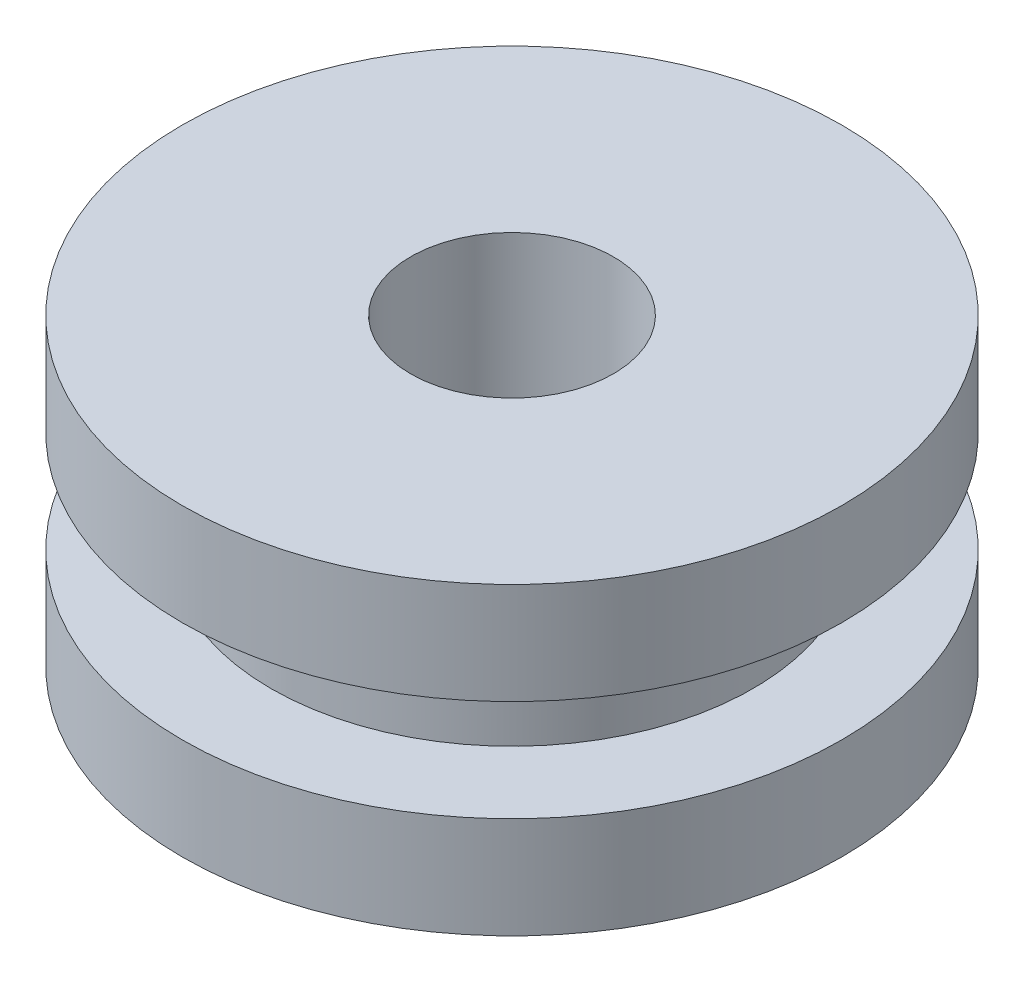
ISO-10303-21;
HEADER;
FILE_DESCRIPTION(('STEP AP214'),'2;1');
FILE_NAME('part.step','',(''),(''),'','','');
FILE_SCHEMA(('AUTOMOTIVE_DESIGN { 1 0 10303 214 1 1 1 1 }'));
ENDSEC;
DATA;
#1=APPLICATION_CONTEXT('core data for automotive mechanical design processes');
#2=APPLICATION_PROTOCOL_DEFINITION('international standard','automotive_design',2000,#1);
#3=PRODUCT_CONTEXT('',#1,'mechanical');
#4=PRODUCT('Part','Part','',(#3));
#5=PRODUCT_RELATED_PRODUCT_CATEGORY('part','',(#4));
#6=PRODUCT_DEFINITION_FORMATION('','',#4);
#7=PRODUCT_DEFINITION_CONTEXT('part definition',#1,'design');
#8=PRODUCT_DEFINITION('design','',#6,#7);
#9=PRODUCT_DEFINITION_SHAPE('','',#8);
#10=(LENGTH_UNIT() NAMED_UNIT(*) SI_UNIT(.MILLI.,.METRE.));
#11=(NAMED_UNIT(*) PLANE_ANGLE_UNIT() SI_UNIT($,.RADIAN.));
#12=(NAMED_UNIT(*) SI_UNIT($,.STERADIAN.) SOLID_ANGLE_UNIT());
#13=UNCERTAINTY_MEASURE_WITH_UNIT(LENGTH_MEASURE(1.E-05),#10,'distance_accuracy_value','');
#14=(GEOMETRIC_REPRESENTATION_CONTEXT(3) GLOBAL_UNCERTAINTY_ASSIGNED_CONTEXT((#13)) GLOBAL_UNIT_ASSIGNED_CONTEXT((#10,
#11,#12)) REPRESENTATION_CONTEXT('',''));
#15=CARTESIAN_POINT('',(0.,0.,0.));
#16=DIRECTION('',(0.,0.,1.));
#17=DIRECTION('',(1.,0.,0.));
#18=AXIS2_PLACEMENT_3D('',#15,#16,#17);
#19=CARTESIAN_POINT('',(0.,6.,0.));
#20=DIRECTION('',(0.,-1.,0.));
#21=DIRECTION('',(0.,0.,-1.));
#22=AXIS2_PLACEMENT_3D('',#19,#20,#21);
#23=CYLINDRICAL_SURFACE('',#22,6.5);
#24=CARTESIAN_POINT('',(0.,0.,0.));
#25=DIRECTION('',(0.,1.,0.));
#26=DIRECTION('',(0.,0.,1.));
#27=AXIS2_PLACEMENT_3D('',#24,#25,#26);
#28=CIRCLE('',#27,6.5);
#29=CARTESIAN_POINT('',(0.,0.,6.5));
#30=VERTEX_POINT('',#29);
#31=EDGE_CURVE('E40',#30,#30,#28,.T.);
#32=ORIENTED_EDGE('',*,*,#31,.T.);
#33=EDGE_LOOP('',(#32));
#34=FACE_BOUND('',#33,.T.);
#35=CARTESIAN_POINT('',(0.,2.,0.));
#36=DIRECTION('',(0.,1.,0.));
#37=DIRECTION('',(0.,0.,1.));
#38=AXIS2_PLACEMENT_3D('',#35,#36,#37);
#39=CIRCLE('',#38,6.5);
#40=CARTESIAN_POINT('',(0.,2.,6.5));
#41=VERTEX_POINT('',#40);
#42=EDGE_CURVE('E50',#41,#41,#39,.T.);
#43=ORIENTED_EDGE('',*,*,#42,.F.);
#44=EDGE_LOOP('',(#43));
#45=FACE_BOUND('',#44,.T.);
#46=ADVANCED_FACE('F32',(#34,#45),#23,.T.);
#47=CARTESIAN_POINT('',(0.,6.,0.));
#48=DIRECTION('',(0.,1.,0.));
#49=DIRECTION('',(0.,0.,1.));
#50=AXIS2_PLACEMENT_3D('',#47,#48,#49);
#51=PLANE('',#50);
#52=CARTESIAN_POINT('',(0.,6.,0.));
#53=DIRECTION('',(0.,1.,0.));
#54=DIRECTION('',(0.,0.,1.));
#55=AXIS2_PLACEMENT_3D('',#52,#53,#54);
#56=CIRCLE('',#55,6.5);
#57=CARTESIAN_POINT('',(0.,6.,6.5));
#58=VERTEX_POINT('',#57);
#59=EDGE_CURVE('E10',#58,#58,#56,.T.);
#60=ORIENTED_EDGE('',*,*,#59,.T.);
#61=EDGE_LOOP('',(#60));
#62=FACE_BOUND('',#61,.T.);
#63=CARTESIAN_POINT('',(0.,6.,0.));
#64=DIRECTION('',(0.,1.,0.));
#65=DIRECTION('',(0.,0.,1.));
#66=AXIS2_PLACEMENT_3D('',#63,#64,#65);
#67=CIRCLE('',#66,2.);
#68=CARTESIAN_POINT('',(0.,6.,2.));
#69=VERTEX_POINT('',#68);
#70=EDGE_CURVE('E45',#69,#69,#67,.T.);
#71=ORIENTED_EDGE('',*,*,#70,.F.);
#72=EDGE_LOOP('',(#71));
#73=FACE_BOUND('',#72,.T.);
#74=ADVANCED_FACE('F84',(#62,#73),#51,.T.);
#75=CARTESIAN_POINT('',(0.,0.,0.));
#76=DIRECTION('',(0.,1.,0.));
#77=DIRECTION('',(0.,0.,1.));
#78=AXIS2_PLACEMENT_3D('',#75,#76,#77);
#79=PLANE('',#78);
#80=ORIENTED_EDGE('',*,*,#31,.F.);
#81=EDGE_LOOP('',(#80));
#82=FACE_BOUND('',#81,.T.);
#83=CARTESIAN_POINT('',(0.,0.,0.));
#84=DIRECTION('',(0.,1.,0.));
#85=DIRECTION('',(0.,0.,1.));
#86=AXIS2_PLACEMENT_3D('',#83,#84,#85);
#87=CIRCLE('',#86,2.);
#88=CARTESIAN_POINT('',(0.,0.,2.));
#89=VERTEX_POINT('',#88);
#90=EDGE_CURVE('E48',#89,#89,#87,.T.);
#91=ORIENTED_EDGE('',*,*,#90,.T.);
#92=EDGE_LOOP('',(#91));
#93=FACE_BOUND('',#92,.T.);
#94=ADVANCED_FACE('F69',(#82,#93),#79,.F.);
#95=CARTESIAN_POINT('',(0.,4.,0.));
#96=DIRECTION('',(0.,1.,0.));
#97=DIRECTION('',(0.,0.,1.));
#98=AXIS2_PLACEMENT_3D('',#95,#96,#97);
#99=CIRCLE('',#98,6.5);
#100=CARTESIAN_POINT('',(0.,4.,6.5));
#101=VERTEX_POINT('',#100);
#102=EDGE_CURVE('E36',#101,#101,#99,.T.);
#103=ORIENTED_EDGE('',*,*,#102,.T.);
#104=EDGE_LOOP('',(#103));
#105=FACE_BOUND('',#104,.T.);
#106=ORIENTED_EDGE('',*,*,#59,.F.);
#107=EDGE_LOOP('',(#106));
#108=FACE_BOUND('',#107,.T.);
#109=ADVANCED_FACE('F34',(#105,#108),#23,.T.);
#110=CARTESIAN_POINT('',(0.,6.,0.));
#111=DIRECTION('',(0.,-1.,0.));
#112=DIRECTION('',(0.,0.,-1.));
#113=AXIS2_PLACEMENT_3D('',#110,#111,#112);
#114=CYLINDRICAL_SURFACE('',#113,2.);
#115=ORIENTED_EDGE('',*,*,#70,.T.);
#116=EDGE_LOOP('',(#115));
#117=FACE_BOUND('',#116,.T.);
#118=ORIENTED_EDGE('',*,*,#90,.F.);
#119=EDGE_LOOP('',(#118));
#120=FACE_BOUND('',#119,.T.);
#121=ADVANCED_FACE('F71',(#117,#120),#114,.F.);
#122=CARTESIAN_POINT('',(0.,4.,0.));
#123=DIRECTION('',(0.,1.,0.));
#124=DIRECTION('',(0.,0.,1.));
#125=AXIS2_PLACEMENT_3D('',#122,#123,#124);
#126=PLANE('',#125);
#127=CARTESIAN_POINT('',(0.,4.,0.));
#128=DIRECTION('',(0.,1.,0.));
#129=DIRECTION('',(0.,0.,1.));
#130=AXIS2_PLACEMENT_3D('',#127,#128,#129);
#131=CIRCLE('',#130,4.75);
#132=CARTESIAN_POINT('',(0.,4.,4.75));
#133=VERTEX_POINT('',#132);
#134=EDGE_CURVE('E52',#133,#133,#131,.T.);
#135=ORIENTED_EDGE('',*,*,#134,.T.);
#136=EDGE_LOOP('',(#135));
#137=FACE_BOUND('',#136,.T.);
#138=ORIENTED_EDGE('',*,*,#102,.F.);
#139=EDGE_LOOP('',(#138));
#140=FACE_BOUND('',#139,.T.);
#141=ADVANCED_FACE('F73',(#137,#140),#126,.F.);
#142=CARTESIAN_POINT('',(0.,2.,0.));
#143=DIRECTION('',(0.,1.,0.));
#144=DIRECTION('',(0.,0.,1.));
#145=AXIS2_PLACEMENT_3D('',#142,#143,#144);
#146=PLANE('',#145);
#147=CARTESIAN_POINT('',(0.,2.,0.));
#148=DIRECTION('',(0.,1.,0.));
#149=DIRECTION('',(0.,0.,1.));
#150=AXIS2_PLACEMENT_3D('',#147,#148,#149);
#151=CIRCLE('',#150,4.75);
#152=CARTESIAN_POINT('',(0.,2.,4.75));
#153=VERTEX_POINT('',#152);
#154=EDGE_CURVE('E57',#153,#153,#151,.T.);
#155=ORIENTED_EDGE('',*,*,#154,.F.);
#156=EDGE_LOOP('',(#155));
#157=FACE_BOUND('',#156,.T.);
#158=ORIENTED_EDGE('',*,*,#42,.T.);
#159=EDGE_LOOP('',(#158));
#160=FACE_BOUND('',#159,.T.);
#161=ADVANCED_FACE('F79',(#157,#160),#146,.T.);
#162=CARTESIAN_POINT('',(0.,4.,0.));
#163=DIRECTION('',(0.,-1.,0.));
#164=DIRECTION('',(0.,0.,-1.));
#165=AXIS2_PLACEMENT_3D('',#162,#163,#164);
#166=CYLINDRICAL_SURFACE('',#165,4.75);
#167=ORIENTED_EDGE('',*,*,#134,.F.);
#168=EDGE_LOOP('',(#167));
#169=FACE_BOUND('',#168,.T.);
#170=ORIENTED_EDGE('',*,*,#154,.T.);
#171=EDGE_LOOP('',(#170));
#172=FACE_BOUND('',#171,.T.);
#173=ADVANCED_FACE('F119',(#169,#172),#166,.T.);
#174=CLOSED_SHELL('',(#46,#74,#94,#109,#121,#141,#161,#173));
#175=MANIFOLD_SOLID_BREP('B2',#174);
#176=ADVANCED_BREP_SHAPE_REPRESENTATION('',(#18,#175),#14);
#177=SHAPE_DEFINITION_REPRESENTATION(#9,#176);
ENDSEC;
END-ISO-10303-21;
